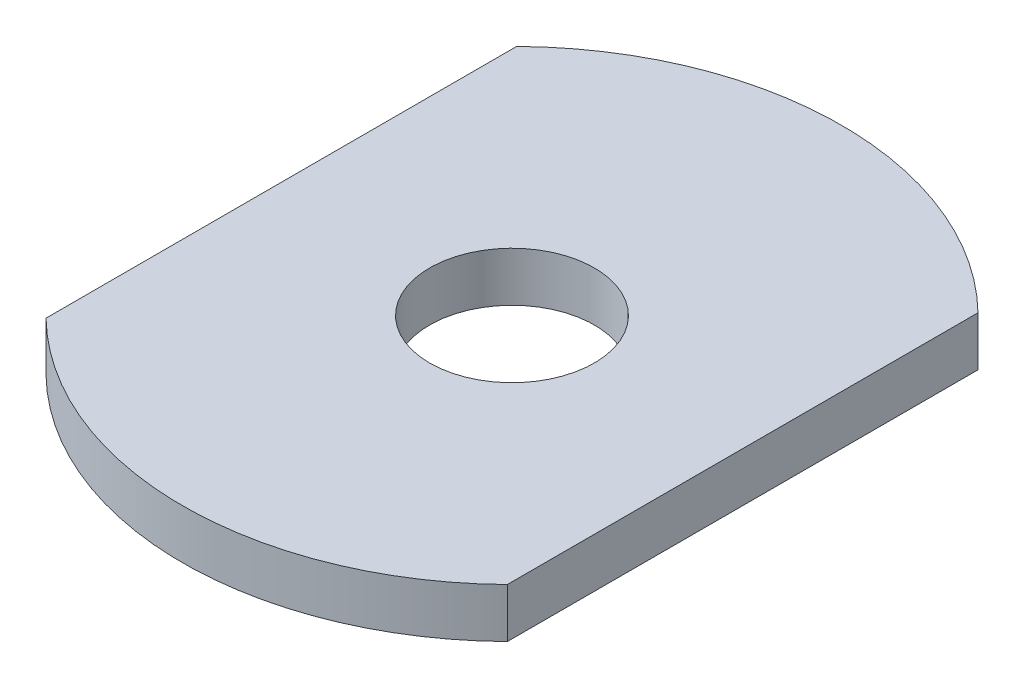
ISO-10303-21;
HEADER;
FILE_DESCRIPTION(('STEP AP214'),'2;1');
FILE_NAME('part.step','',(''),(''),'','','');
FILE_SCHEMA(('AUTOMOTIVE_DESIGN { 1 0 10303 214 1 1 1 1 }'));
ENDSEC;
DATA;
#1=APPLICATION_CONTEXT('core data for automotive mechanical design processes');
#2=APPLICATION_PROTOCOL_DEFINITION('international standard','automotive_design',2000,#1);
#3=PRODUCT_CONTEXT('',#1,'mechanical');
#4=PRODUCT('Part','Part','',(#3));
#5=PRODUCT_RELATED_PRODUCT_CATEGORY('part','',(#4));
#6=PRODUCT_DEFINITION_FORMATION('','',#4);
#7=PRODUCT_DEFINITION_CONTEXT('part definition',#1,'design');
#8=PRODUCT_DEFINITION('design','',#6,#7);
#9=PRODUCT_DEFINITION_SHAPE('','',#8);
#10=(LENGTH_UNIT() NAMED_UNIT(*) SI_UNIT(.MILLI.,.METRE.));
#11=(NAMED_UNIT(*) PLANE_ANGLE_UNIT() SI_UNIT($,.RADIAN.));
#12=(NAMED_UNIT(*) SI_UNIT($,.STERADIAN.) SOLID_ANGLE_UNIT());
#13=UNCERTAINTY_MEASURE_WITH_UNIT(LENGTH_MEASURE(1.E-05),#10,'distance_accuracy_value','');
#14=(GEOMETRIC_REPRESENTATION_CONTEXT(3) GLOBAL_UNCERTAINTY_ASSIGNED_CONTEXT((#13)) GLOBAL_UNIT_ASSIGNED_CONTEXT((#10,
#11,#12)) REPRESENTATION_CONTEXT('',''));
#15=CARTESIAN_POINT('',(0.,0.,0.));
#16=DIRECTION('',(0.,0.,1.));
#17=DIRECTION('',(1.,0.,0.));
#18=AXIS2_PLACEMENT_3D('',#15,#16,#17);
#19=CARTESIAN_POINT('',(0.,0.6,0.));
#20=DIRECTION('',(0.,1.,0.));
#21=DIRECTION('',(0.,0.,1.));
#22=AXIS2_PLACEMENT_3D('',#19,#20,#21);
#23=PLANE('',#22);
#24=CARTESIAN_POINT('',(0.,0.6,0.));
#25=DIRECTION('',(0.,1.,0.));
#26=DIRECTION('',(0.,0.,1.));
#27=AXIS2_PLACEMENT_3D('',#24,#25,#26);
#28=CIRCLE('',#27,1.);
#29=CARTESIAN_POINT('',(0.,0.6,1.));
#30=VERTEX_POINT('',#29);
#31=EDGE_CURVE('E117',#30,#30,#28,.T.);
#32=ORIENTED_EDGE('',*,*,#31,.F.);
#33=EDGE_LOOP('',(#32));
#34=FACE_BOUND('',#33,.T.);
#35=CARTESIAN_POINT('',(0.,0.6,0.));
#36=DIRECTION('',(0.,1.,0.));
#37=DIRECTION('',(0.,0.,1.));
#38=AXIS2_PLACEMENT_3D('',#35,#36,#37);
#39=CIRCLE('',#38,4.);
#40=CARTESIAN_POINT('',(2.8,0.6,-2.85657137141714));
#41=VERTEX_POINT('',#40);
#42=CARTESIAN_POINT('',(-2.8,0.6,-2.85657137141714));
#43=VERTEX_POINT('',#42);
#44=EDGE_CURVE('E13',#41,#43,#39,.T.);
#45=ORIENTED_EDGE('',*,*,#44,.T.);
#46=DIRECTION('',(0.,0.,1.));
#47=VECTOR('',#46,1.);
#48=CARTESIAN_POINT('',(-2.8,0.6,0.));
#49=LINE('',#48,#47);
#50=CARTESIAN_POINT('',(-2.8,0.6,2.85657137141714));
#51=VERTEX_POINT('',#50);
#52=EDGE_CURVE('E92',#43,#51,#49,.T.);
#53=ORIENTED_EDGE('',*,*,#52,.T.);
#54=CARTESIAN_POINT('',(2.8,0.6,2.85657137141714));
#55=VERTEX_POINT('',#54);
#56=EDGE_CURVE('E61',#51,#55,#39,.T.);
#57=ORIENTED_EDGE('',*,*,#56,.T.);
#58=DIRECTION('',(0.,0.,1.));
#59=VECTOR('',#58,1.);
#60=CARTESIAN_POINT('',(2.8,0.6,0.));
#61=LINE('',#60,#59);
#62=EDGE_CURVE('E76',#41,#55,#61,.T.);
#63=ORIENTED_EDGE('',*,*,#62,.F.);
#64=EDGE_LOOP('',(#45,#53,#57,#63));
#65=FACE_BOUND('',#64,.T.);
#66=ADVANCED_FACE('F52',(#34,#65),#23,.T.);
#67=CARTESIAN_POINT('',(0.,0.,0.));
#68=DIRECTION('',(0.,1.,0.));
#69=DIRECTION('',(0.,0.,1.));
#70=AXIS2_PLACEMENT_3D('',#67,#68,#69);
#71=PLANE('',#70);
#72=CARTESIAN_POINT('',(0.,0.,0.));
#73=DIRECTION('',(0.,1.,0.));
#74=DIRECTION('',(0.,0.,1.));
#75=AXIS2_PLACEMENT_3D('',#72,#73,#74);
#76=CIRCLE('',#75,1.);
#77=CARTESIAN_POINT('',(0.,0.,1.));
#78=VERTEX_POINT('',#77);
#79=EDGE_CURVE('E120',#78,#78,#76,.T.);
#80=ORIENTED_EDGE('',*,*,#79,.T.);
#81=EDGE_LOOP('',(#80));
#82=FACE_BOUND('',#81,.T.);
#83=DIRECTION('',(0.,0.,-1.));
#84=VECTOR('',#83,1.);
#85=CARTESIAN_POINT('',(-2.8,0.,0.));
#86=LINE('',#85,#84);
#87=CARTESIAN_POINT('',(-2.8,0.,2.85657137141714));
#88=VERTEX_POINT('',#87);
#89=CARTESIAN_POINT('',(-2.8,0.,-2.85657137141714));
#90=VERTEX_POINT('',#89);
#91=EDGE_CURVE('E68',#88,#90,#86,.T.);
#92=ORIENTED_EDGE('',*,*,#91,.T.);
#93=CARTESIAN_POINT('',(0.,0.,0.));
#94=DIRECTION('',(0.,1.,0.));
#95=DIRECTION('',(0.,0.,1.));
#96=AXIS2_PLACEMENT_3D('',#93,#94,#95);
#97=CIRCLE('',#96,4.);
#98=CARTESIAN_POINT('',(2.8,0.,-2.85657137141714));
#99=VERTEX_POINT('',#98);
#100=EDGE_CURVE('E107',#99,#90,#97,.T.);
#101=ORIENTED_EDGE('',*,*,#100,.F.);
#102=DIRECTION('',(0.,0.,-1.));
#103=VECTOR('',#102,1.);
#104=CARTESIAN_POINT('',(2.8,0.,0.));
#105=LINE('',#104,#103);
#106=CARTESIAN_POINT('',(2.8,0.,2.85657137141714));
#107=VERTEX_POINT('',#106);
#108=EDGE_CURVE('E100',#107,#99,#105,.T.);
#109=ORIENTED_EDGE('',*,*,#108,.F.);
#110=EDGE_CURVE('E56',#88,#107,#97,.T.);
#111=ORIENTED_EDGE('',*,*,#110,.F.);
#112=EDGE_LOOP('',(#92,#101,#109,#111));
#113=FACE_BOUND('',#112,.T.);
#114=ADVANCED_FACE('F128',(#82,#113),#71,.F.);
#115=CARTESIAN_POINT('',(0.,0.6,0.));
#116=DIRECTION('',(0.,-1.,0.));
#117=DIRECTION('',(0.,0.,-1.));
#118=AXIS2_PLACEMENT_3D('',#115,#116,#117);
#119=CYLINDRICAL_SURFACE('',#118,4.);
#120=DIRECTION('',(0.,1.,0.));
#121=VECTOR('',#120,1.);
#122=CARTESIAN_POINT('',(-2.8,-5.83780780773057,-2.85657137141714));
#123=LINE('',#122,#121);
#124=EDGE_CURVE('E95',#90,#43,#123,.T.);
#125=ORIENTED_EDGE('',*,*,#124,.T.);
#126=ORIENTED_EDGE('',*,*,#44,.F.);
#127=DIRECTION('',(0.,1.,0.));
#128=VECTOR('',#127,1.);
#129=CARTESIAN_POINT('',(2.8,-5.83780780773057,-2.85657137141714));
#130=LINE('',#129,#128);
#131=EDGE_CURVE('E109',#99,#41,#130,.T.);
#132=ORIENTED_EDGE('',*,*,#131,.F.);
#133=ORIENTED_EDGE('',*,*,#100,.T.);
#134=EDGE_LOOP('',(#125,#126,#132,#133));
#135=FACE_BOUND('',#134,.T.);
#136=ADVANCED_FACE('F54',(#135),#119,.T.);
#137=DIRECTION('',(0.,1.,0.));
#138=VECTOR('',#137,1.);
#139=CARTESIAN_POINT('',(-2.8,-5.83780780773057,2.85657137141714));
#140=LINE('',#139,#138);
#141=EDGE_CURVE('E96',#88,#51,#140,.T.);
#142=ORIENTED_EDGE('',*,*,#141,.F.);
#143=ORIENTED_EDGE('',*,*,#110,.T.);
#144=DIRECTION('',(0.,1.,0.));
#145=VECTOR('',#144,1.);
#146=CARTESIAN_POINT('',(2.8,-5.83780780773057,2.85657137141714));
#147=LINE('',#146,#145);
#148=EDGE_CURVE('E111',#107,#55,#147,.T.);
#149=ORIENTED_EDGE('',*,*,#148,.T.);
#150=ORIENTED_EDGE('',*,*,#56,.F.);
#151=EDGE_LOOP('',(#142,#143,#149,#150));
#152=FACE_BOUND('',#151,.T.);
#153=ADVANCED_FACE('F125',(#152),#119,.T.);
#154=CARTESIAN_POINT('',(0.,0.6,0.));
#155=DIRECTION('',(0.,-1.,0.));
#156=DIRECTION('',(0.,0.,-1.));
#157=AXIS2_PLACEMENT_3D('',#154,#155,#156);
#158=CYLINDRICAL_SURFACE('',#157,1.);
#159=ORIENTED_EDGE('',*,*,#31,.T.);
#160=EDGE_LOOP('',(#159));
#161=FACE_BOUND('',#160,.T.);
#162=ORIENTED_EDGE('',*,*,#79,.F.);
#163=EDGE_LOOP('',(#162));
#164=FACE_BOUND('',#163,.T.);
#165=ADVANCED_FACE('F131',(#161,#164),#158,.F.);
#166=CARTESIAN_POINT('',(2.8,-5.83780780773057,0.));
#167=DIRECTION('',(-1.,0.,0.));
#168=DIRECTION('',(0.,0.,1.));
#169=AXIS2_PLACEMENT_3D('',#166,#167,#168);
#170=PLANE('',#169);
#171=ORIENTED_EDGE('',*,*,#108,.T.);
#172=ORIENTED_EDGE('',*,*,#131,.T.);
#173=ORIENTED_EDGE('',*,*,#62,.T.);
#174=ORIENTED_EDGE('',*,*,#148,.F.);
#175=EDGE_LOOP('',(#171,#172,#173,#174));
#176=FACE_BOUND('',#175,.T.);
#177=ADVANCED_FACE('F129',(#176),#170,.F.);
#178=CARTESIAN_POINT('',(-2.8,-5.83780780773057,0.));
#179=DIRECTION('',(-1.,0.,0.));
#180=DIRECTION('',(0.,0.,1.));
#181=AXIS2_PLACEMENT_3D('',#178,#179,#180);
#182=PLANE('',#181);
#183=ORIENTED_EDGE('',*,*,#141,.T.);
#184=ORIENTED_EDGE('',*,*,#52,.F.);
#185=ORIENTED_EDGE('',*,*,#124,.F.);
#186=ORIENTED_EDGE('',*,*,#91,.F.);
#187=EDGE_LOOP('',(#183,#184,#185,#186));
#188=FACE_BOUND('',#187,.T.);
#189=ADVANCED_FACE('F94',(#188),#182,.T.);
#190=CLOSED_SHELL('',(#66,#114,#136,#153,#165,#177,#189));
#191=MANIFOLD_SOLID_BREP('B2',#190);
#192=ADVANCED_BREP_SHAPE_REPRESENTATION('',(#18,#191),#14);
#193=SHAPE_DEFINITION_REPRESENTATION(#9,#192);
ENDSEC;
END-ISO-10303-21;
